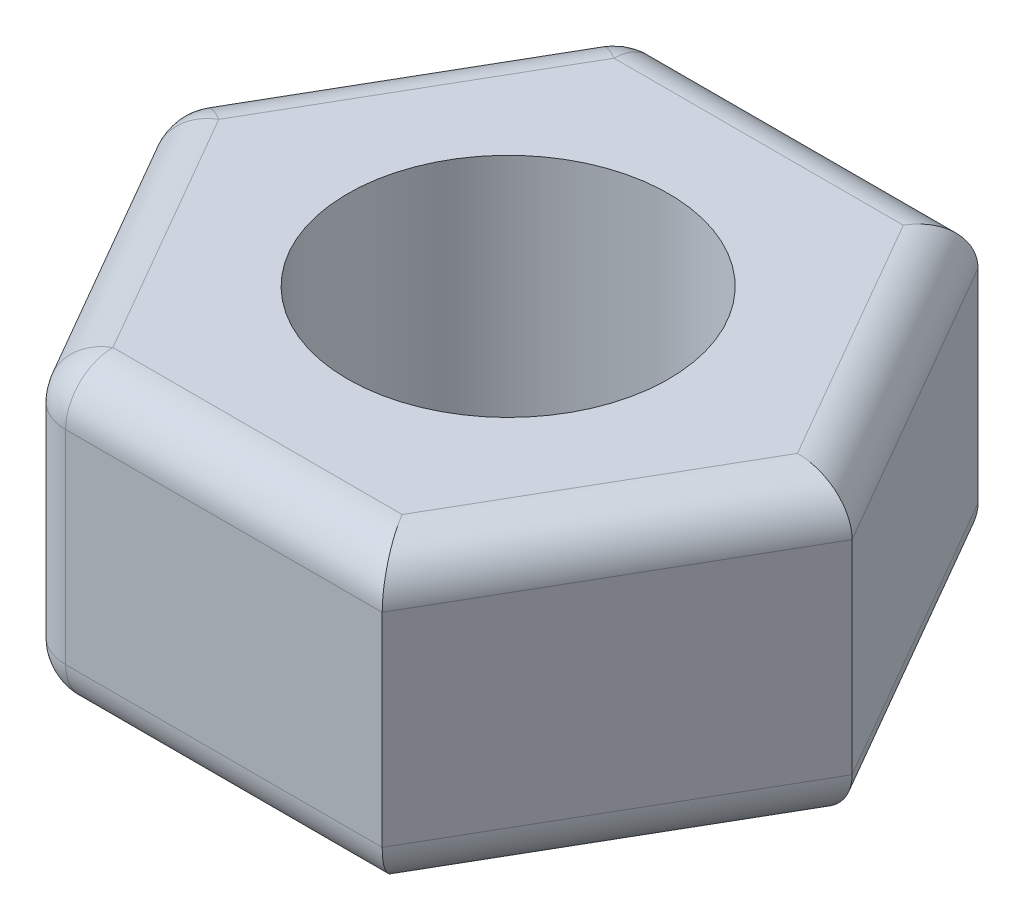
ISO-10303-21;
HEADER;
FILE_DESCRIPTION(('STEP AP214'),'2;1');
FILE_NAME('part.step','',(''),(''),'','','');
FILE_SCHEMA(('AUTOMOTIVE_DESIGN { 1 0 10303 214 1 1 1 1 }'));
ENDSEC;
DATA;
#1=APPLICATION_CONTEXT('core data for automotive mechanical design processes');
#2=APPLICATION_PROTOCOL_DEFINITION('international standard','automotive_design',2000,#1);
#3=PRODUCT_CONTEXT('',#1,'mechanical');
#4=PRODUCT('Part','Part','',(#3));
#5=PRODUCT_RELATED_PRODUCT_CATEGORY('part','',(#4));
#6=PRODUCT_DEFINITION_FORMATION('','',#4);
#7=PRODUCT_DEFINITION_CONTEXT('part definition',#1,'design');
#8=PRODUCT_DEFINITION('design','',#6,#7);
#9=PRODUCT_DEFINITION_SHAPE('','',#8);
#10=(LENGTH_UNIT() NAMED_UNIT(*) SI_UNIT(.MILLI.,.METRE.));
#11=(NAMED_UNIT(*) PLANE_ANGLE_UNIT() SI_UNIT($,.RADIAN.));
#12=(NAMED_UNIT(*) SI_UNIT($,.STERADIAN.) SOLID_ANGLE_UNIT());
#13=UNCERTAINTY_MEASURE_WITH_UNIT(LENGTH_MEASURE(1.E-05),#10,'distance_accuracy_value','');
#14=(GEOMETRIC_REPRESENTATION_CONTEXT(3) GLOBAL_UNCERTAINTY_ASSIGNED_CONTEXT((#13)) GLOBAL_UNIT_ASSIGNED_CONTEXT((#10,
#11,#12)) REPRESENTATION_CONTEXT('',''));
#15=CARTESIAN_POINT('',(0.,0.,0.));
#16=DIRECTION('',(0.,0.,1.));
#17=DIRECTION('',(1.,0.,0.));
#18=AXIS2_PLACEMENT_3D('',#15,#16,#17);
#19=CARTESIAN_POINT('',(3.63220000000007,6.2992,6.29115494325163));
#20=DIRECTION('',(-0.866025403784441,0.,-0.499999999999995));
#21=DIRECTION('',(-0.499999999999995,0.,0.866025403784442));
#22=AXIS2_PLACEMENT_3D('',#19,#20,#21);
#23=PLANE('',#22);
#24=DIRECTION('',(0.,-1.,0.));
#25=VECTOR('',#24,1.);
#26=CARTESIAN_POINT('',(3.63220000000007,6.2992,6.29115494325163));
#27=LINE('',#26,#25);
#28=CARTESIAN_POINT('',(3.63220000000007,5.2992,6.29115494325163));
#29=VERTEX_POINT('',#28);
#30=CARTESIAN_POINT('',(3.63220000000007,1.,6.29115494325163));
#31=VERTEX_POINT('',#30);
#32=EDGE_CURVE('E298',#29,#31,#27,.T.);
#33=ORIENTED_EDGE('',*,*,#32,.T.);
#34=DIRECTION('',(0.499999999999995,0.,-0.866025403784442));
#35=VECTOR('',#34,1.);
#36=CARTESIAN_POINT('',(3.63220000000007,1.,6.29115494325163));
#37=LINE('',#36,#35);
#38=CARTESIAN_POINT('',(7.2644,1.,0.));
#39=VERTEX_POINT('',#38);
#40=EDGE_CURVE('E232',#31,#39,#37,.T.);
#41=ORIENTED_EDGE('',*,*,#40,.T.);
#42=DIRECTION('',(0.,-1.,0.));
#43=VECTOR('',#42,1.);
#44=CARTESIAN_POINT('',(7.2644,6.2992,0.));
#45=LINE('',#44,#43);
#46=CARTESIAN_POINT('',(7.2644,5.2992,0.));
#47=VERTEX_POINT('',#46);
#48=EDGE_CURVE('E301',#47,#39,#45,.T.);
#49=ORIENTED_EDGE('',*,*,#48,.F.);
#50=DIRECTION('',(0.499999999999995,0.,-0.866025403784442));
#51=VECTOR('',#50,1.);
#52=CARTESIAN_POINT('',(3.63220000000007,5.2992,6.29115494325163));
#53=LINE('',#52,#51);
#54=EDGE_CURVE('E230',#47,#29,#53,.F.);
#55=ORIENTED_EDGE('',*,*,#54,.T.);
#56=EDGE_LOOP('',(#33,#41,#49,#55));
#57=FACE_BOUND('',#56,.T.);
#58=ADVANCED_FACE('F38',(#57),#23,.F.);
#59=CARTESIAN_POINT('',(7.2644,6.2992,0.));
#60=DIRECTION('',(-0.866025403784438,0.,0.500000000000001));
#61=DIRECTION('',(0.500000000000001,0.,0.866025403784438));
#62=AXIS2_PLACEMENT_3D('',#59,#60,#61);
#63=PLANE('',#62);
#64=ORIENTED_EDGE('',*,*,#48,.T.);
#65=DIRECTION('',(-0.500000000000001,0.,-0.866025403784438));
#66=VECTOR('',#65,1.);
#67=CARTESIAN_POINT('',(7.2644,1.,0.));
#68=LINE('',#67,#66);
#69=CARTESIAN_POINT('',(3.63219999999999,1.,-6.29115494325168));
#70=VERTEX_POINT('',#69);
#71=EDGE_CURVE('E228',#39,#70,#68,.T.);
#72=ORIENTED_EDGE('',*,*,#71,.T.);
#73=DIRECTION('',(0.,-1.,0.));
#74=VECTOR('',#73,1.);
#75=CARTESIAN_POINT('',(3.63219999999999,6.2992,-6.29115494325168));
#76=LINE('',#75,#74);
#77=CARTESIAN_POINT('',(3.63219999999999,5.2992,-6.29115494325168));
#78=VERTEX_POINT('',#77);
#79=EDGE_CURVE('E306',#78,#70,#76,.T.);
#80=ORIENTED_EDGE('',*,*,#79,.F.);
#81=DIRECTION('',(-0.500000000000001,0.,-0.866025403784438));
#82=VECTOR('',#81,1.);
#83=CARTESIAN_POINT('',(7.2644,5.2992,0.));
#84=LINE('',#83,#82);
#85=EDGE_CURVE('E226',#78,#47,#84,.F.);
#86=ORIENTED_EDGE('',*,*,#85,.T.);
#87=EDGE_LOOP('',(#64,#72,#80,#86));
#88=FACE_BOUND('',#87,.T.);
#89=ADVANCED_FACE('F337',(#88),#63,.F.);
#90=CARTESIAN_POINT('',(3.63219999999999,6.2992,-6.29115494325168));
#91=DIRECTION('',(0.,0.,1.));
#92=DIRECTION('',(1.,0.,0.));
#93=AXIS2_PLACEMENT_3D('',#90,#91,#92);
#94=PLANE('',#93);
#95=ORIENTED_EDGE('',*,*,#79,.T.);
#96=DIRECTION('',(-1.,0.,0.));
#97=VECTOR('',#96,1.);
#98=CARTESIAN_POINT('',(3.63219999999999,1.,-6.29115494325168));
#99=LINE('',#98,#97);
#100=CARTESIAN_POINT('',(-3.0548497308104,1.,-6.29115494325166));
#101=VERTEX_POINT('',#100);
#102=EDGE_CURVE('E198',#70,#101,#99,.T.);
#103=ORIENTED_EDGE('',*,*,#102,.T.);
#104=DIRECTION('',(0.,-1.,0.));
#105=VECTOR('',#104,1.);
#106=CARTESIAN_POINT('',(-3.0548497308104,6.2992,-6.29115494325166));
#107=LINE('',#106,#105);
#108=CARTESIAN_POINT('',(-3.0548497308104,5.2992,-6.29115494325166));
#109=VERTEX_POINT('',#108);
#110=EDGE_CURVE('E195',#101,#109,#107,.F.);
#111=ORIENTED_EDGE('',*,*,#110,.T.);
#112=DIRECTION('',(-1.,0.,0.));
#113=VECTOR('',#112,1.);
#114=CARTESIAN_POINT('',(3.63219999999999,5.2992,-6.29115494325168));
#115=LINE('',#114,#113);
#116=EDGE_CURVE('E193',#109,#78,#115,.F.);
#117=ORIENTED_EDGE('',*,*,#116,.T.);
#118=EDGE_LOOP('',(#95,#103,#111,#117));
#119=FACE_BOUND('',#118,.T.);
#120=ADVANCED_FACE('F341',(#119),#94,.F.);
#121=CARTESIAN_POINT('',(-3.63220000000003,6.2992,-6.29115494325166));
#122=DIRECTION('',(0.866025403784441,0.,0.499999999999995));
#123=DIRECTION('',(0.499999999999995,0.,-0.866025403784442));
#124=AXIS2_PLACEMENT_3D('',#121,#122,#123);
#125=PLANE('',#124);
#126=DIRECTION('',(-0.499999999999995,0.,0.866025403784442));
#127=VECTOR('',#126,1.);
#128=CARTESIAN_POINT('',(-3.63220000000003,5.2992,-6.29115494325166));
#129=LINE('',#128,#127);
#130=CARTESIAN_POINT('',(-6.97572486540519,5.2992,-0.499999999999951));
#131=VERTEX_POINT('',#130);
#132=CARTESIAN_POINT('',(-3.92087513459484,5.2992,-5.79115494325166));
#133=VERTEX_POINT('',#132);
#134=EDGE_CURVE('E178',#131,#133,#129,.F.);
#135=ORIENTED_EDGE('',*,*,#134,.T.);
#136=DIRECTION('',(0.,-1.,0.));
#137=VECTOR('',#136,1.);
#138=CARTESIAN_POINT('',(-3.92087513459484,6.2992,-5.79115494325166));
#139=LINE('',#138,#137);
#140=CARTESIAN_POINT('',(-3.92087513459484,1.,-5.79115494325166));
#141=VERTEX_POINT('',#140);
#142=EDGE_CURVE('E191',#133,#141,#139,.T.);
#143=ORIENTED_EDGE('',*,*,#142,.T.);
#144=DIRECTION('',(-0.499999999999995,0.,0.866025403784442));
#145=VECTOR('',#144,1.);
#146=CARTESIAN_POINT('',(-3.63220000000003,1.,-6.29115494325166));
#147=LINE('',#146,#145);
#148=CARTESIAN_POINT('',(-6.97572486540519,1.,-0.499999999999952));
#149=VERTEX_POINT('',#148);
#150=EDGE_CURVE('E189',#141,#149,#147,.T.);
#151=ORIENTED_EDGE('',*,*,#150,.T.);
#152=DIRECTION('',(0.,-1.,0.));
#153=VECTOR('',#152,1.);
#154=CARTESIAN_POINT('',(-6.97572486540519,6.2992,-0.499999999999952));
#155=LINE('',#154,#153);
#156=EDGE_CURVE('E165',#149,#131,#155,.F.);
#157=ORIENTED_EDGE('',*,*,#156,.T.);
#158=EDGE_LOOP('',(#135,#143,#151,#157));
#159=FACE_BOUND('',#158,.T.);
#160=ADVANCED_FACE('F372',(#159),#125,.F.);
#161=CARTESIAN_POINT('',(-7.2644,6.2992,0.));
#162=DIRECTION('',(0.866025403784435,0.,-0.500000000000007));
#163=DIRECTION('',(-0.500000000000007,0.,-0.866025403784435));
#164=AXIS2_PLACEMENT_3D('',#161,#162,#163);
#165=PLANE('',#164);
#166=DIRECTION('',(0.500000000000007,0.,0.866025403784435));
#167=VECTOR('',#166,1.);
#168=CARTESIAN_POINT('',(-7.2644,1.,0.));
#169=LINE('',#168,#167);
#170=CARTESIAN_POINT('',(-6.97572486540518,1.,0.500000000000049));
#171=VERTEX_POINT('',#170);
#172=CARTESIAN_POINT('',(-3.92087513459476,1.,5.79115494325171));
#173=VERTEX_POINT('',#172);
#174=EDGE_CURVE('E208',#171,#173,#169,.T.);
#175=ORIENTED_EDGE('',*,*,#174,.T.);
#176=DIRECTION('',(0.,-1.,0.));
#177=VECTOR('',#176,1.);
#178=CARTESIAN_POINT('',(-3.92087513459476,6.2992,5.79115494325171));
#179=LINE('',#178,#177);
#180=CARTESIAN_POINT('',(-3.92087513459476,5.2992,5.79115494325171));
#181=VERTEX_POINT('',#180);
#182=EDGE_CURVE('E150',#173,#181,#179,.F.);
#183=ORIENTED_EDGE('',*,*,#182,.T.);
#184=DIRECTION('',(0.500000000000007,0.,0.866025403784435));
#185=VECTOR('',#184,1.);
#186=CARTESIAN_POINT('',(-7.2644,5.2992,0.));
#187=LINE('',#186,#185);
#188=CARTESIAN_POINT('',(-6.97572486540518,5.2992,0.500000000000051));
#189=VERTEX_POINT('',#188);
#190=EDGE_CURVE('E144',#181,#189,#187,.F.);
#191=ORIENTED_EDGE('',*,*,#190,.T.);
#192=DIRECTION('',(0.,-1.,0.));
#193=VECTOR('',#192,1.);
#194=CARTESIAN_POINT('',(-6.97572486540518,6.2992,0.500000000000049));
#195=LINE('',#194,#193);
#196=EDGE_CURVE('E148',#189,#171,#195,.T.);
#197=ORIENTED_EDGE('',*,*,#196,.T.);
#198=EDGE_LOOP('',(#175,#183,#191,#197));
#199=FACE_BOUND('',#198,.T.);
#200=ADVANCED_FACE('F146',(#199),#165,.F.);
#201=CARTESIAN_POINT('',(-3.63219999999994,6.2992,6.29115494325171));
#202=DIRECTION('',(0.,0.,-1.));
#203=DIRECTION('',(-1.,0.,0.));
#204=AXIS2_PLACEMENT_3D('',#201,#202,#203);
#205=PLANE('',#204);
#206=DIRECTION('',(0.,-1.,0.));
#207=VECTOR('',#206,1.);
#208=CARTESIAN_POINT('',(-3.05484973081032,6.2992,6.2911549432517));
#209=LINE('',#208,#207);
#210=CARTESIAN_POINT('',(-3.05484973081032,5.2992,6.2911549432517));
#211=VERTEX_POINT('',#210);
#212=CARTESIAN_POINT('',(-3.05484973081032,1.,6.2911549432517));
#213=VERTEX_POINT('',#212);
#214=EDGE_CURVE('E204',#211,#213,#209,.T.);
#215=ORIENTED_EDGE('',*,*,#214,.T.);
#216=DIRECTION('',(1.,0.,0.));
#217=VECTOR('',#216,1.);
#218=CARTESIAN_POINT('',(-3.63219999999994,1.,6.29115494325171));
#219=LINE('',#218,#217);
#220=EDGE_CURVE('E206',#213,#31,#219,.T.);
#221=ORIENTED_EDGE('',*,*,#220,.T.);
#222=ORIENTED_EDGE('',*,*,#32,.F.);
#223=DIRECTION('',(1.,0.,0.));
#224=VECTOR('',#223,1.);
#225=CARTESIAN_POINT('',(-2.47749946162069,5.2992,6.2911549432517));
#226=LINE('',#225,#224);
#227=EDGE_CURVE('E202',#29,#211,#226,.F.);
#228=ORIENTED_EDGE('',*,*,#227,.T.);
#229=EDGE_LOOP('',(#215,#221,#222,#228));
#230=FACE_BOUND('',#229,.T.);
#231=ADVANCED_FACE('F303',(#230),#205,.F.);
#232=CARTESIAN_POINT('',(0.,6.2992,0.));
#233=DIRECTION('',(0.,1.,0.));
#234=DIRECTION('',(0.,0.,1.));
#235=AXIS2_PLACEMENT_3D('',#232,#233,#234);
#236=PLANE('',#235);
#237=CARTESIAN_POINT('',(0.,6.2992,0.));
#238=DIRECTION('',(0.,1.,0.));
#239=DIRECTION('',(0.,0.,1.));
#240=AXIS2_PLACEMENT_3D('',#237,#238,#239);
#241=CIRCLE('',#240,3.3909);
#242=CARTESIAN_POINT('',(0.,6.2992,3.3909));
#243=VERTEX_POINT('',#242);
#244=EDGE_CURVE('E187',#243,#243,#241,.T.);
#245=ORIENTED_EDGE('',*,*,#244,.F.);
#246=EDGE_LOOP('',(#245));
#247=FACE_BOUND('',#246,.T.);
#248=DIRECTION('',(-0.500000000000001,0.,-0.866025403784438));
#249=VECTOR('',#248,1.);
#250=CARTESIAN_POINT('',(2.76617459621555,6.2992,-5.79115494325168));
#251=LINE('',#250,#249);
#252=CARTESIAN_POINT('',(6.10969946162075,6.2992,0.));
#253=VERTEX_POINT('',#252);
#254=CARTESIAN_POINT('',(3.05484973081036,6.2992,-5.29115494325168));
#255=VERTEX_POINT('',#254);
#256=EDGE_CURVE('E47',#253,#255,#251,.T.);
#257=ORIENTED_EDGE('',*,*,#256,.T.);
#258=DIRECTION('',(-1.,0.,0.));
#259=VECTOR('',#258,1.);
#260=CARTESIAN_POINT('',(-2.47749946162077,6.2992,-5.29115494325166));
#261=LINE('',#260,#259);
#262=CARTESIAN_POINT('',(-3.0548497308104,6.2992,-5.29115494325166));
#263=VERTEX_POINT('',#262);
#264=EDGE_CURVE('E11',#255,#263,#261,.T.);
#265=ORIENTED_EDGE('',*,*,#264,.T.);
#266=DIRECTION('',(-0.499999999999995,0.,0.866025403784442));
#267=VECTOR('',#266,1.);
#268=CARTESIAN_POINT('',(-5.82102432702594,6.2992,-0.499999999999955));
#269=LINE('',#268,#267);
#270=CARTESIAN_POINT('',(-6.10969946162075,6.2992,0.));
#271=VERTEX_POINT('',#270);
#272=EDGE_CURVE('E164',#263,#271,#269,.T.);
#273=ORIENTED_EDGE('',*,*,#272,.T.);
#274=DIRECTION('',(0.500000000000007,0.,0.866025403784435));
#275=VECTOR('',#274,1.);
#276=CARTESIAN_POINT('',(-2.76617459621551,6.2992,5.7911549432517));
#277=LINE('',#276,#275);
#278=CARTESIAN_POINT('',(-3.05484973081033,6.2992,5.2911549432517));
#279=VERTEX_POINT('',#278);
#280=EDGE_CURVE('E153',#271,#279,#277,.T.);
#281=ORIENTED_EDGE('',*,*,#280,.T.);
#282=DIRECTION('',(1.,0.,0.));
#283=VECTOR('',#282,1.);
#284=CARTESIAN_POINT('',(3.63220000000006,6.2992,5.29115494325163));
#285=LINE('',#284,#283);
#286=CARTESIAN_POINT('',(3.05484973081044,6.2992,5.29115494325164));
#287=VERTEX_POINT('',#286);
#288=EDGE_CURVE('E234',#279,#287,#285,.T.);
#289=ORIENTED_EDGE('',*,*,#288,.T.);
#290=DIRECTION('',(0.499999999999995,0.,-0.866025403784442));
#291=VECTOR('',#290,1.);
#292=CARTESIAN_POINT('',(6.39837459621556,6.2992,-0.499999999999996));
#293=LINE('',#292,#291);
#294=EDGE_CURVE('E58',#287,#253,#293,.T.);
#295=ORIENTED_EDGE('',*,*,#294,.T.);
#296=EDGE_LOOP('',(#257,#265,#273,#281,#289,#295));
#297=FACE_BOUND('',#296,.T.);
#298=ADVANCED_FACE('F315',(#247,#297),#236,.T.);
#299=CARTESIAN_POINT('',(0.,0.,0.));
#300=DIRECTION('',(0.,1.,0.));
#301=DIRECTION('',(0.,0.,1.));
#302=AXIS2_PLACEMENT_3D('',#299,#300,#301);
#303=PLANE('',#302);
#304=DIRECTION('',(1.,0.,0.));
#305=VECTOR('',#304,1.);
#306=CARTESIAN_POINT('',(0.,0.,5.29115494325167));
#307=LINE('',#306,#305);
#308=CARTESIAN_POINT('',(3.05484973081044,0.,5.29115494325164));
#309=VERTEX_POINT('',#308);
#310=CARTESIAN_POINT('',(-3.05484973081033,0.,5.2911549432517));
#311=VERTEX_POINT('',#310);
#312=EDGE_CURVE('E213',#309,#311,#307,.F.);
#313=ORIENTED_EDGE('',*,*,#312,.T.);
#314=DIRECTION('',(0.500000000000007,0.,0.866025403784435));
#315=VECTOR('',#314,1.);
#316=CARTESIAN_POINT('',(-4.58227459621554,0.,2.64557747162587));
#317=LINE('',#316,#315);
#318=CARTESIAN_POINT('',(-6.10969946162075,0.,0.));
#319=VERTEX_POINT('',#318);
#320=EDGE_CURVE('E223',#311,#319,#317,.F.);
#321=ORIENTED_EDGE('',*,*,#320,.T.);
#322=DIRECTION('',(-0.499999999999995,0.,0.866025403784442));
#323=VECTOR('',#322,1.);
#324=CARTESIAN_POINT('',(-4.58227459621557,0.,-2.64557747162581));
#325=LINE('',#324,#323);
#326=CARTESIAN_POINT('',(-3.0548497308104,0.,-5.29115494325166));
#327=VERTEX_POINT('',#326);
#328=EDGE_CURVE('E221',#319,#327,#325,.F.);
#329=ORIENTED_EDGE('',*,*,#328,.T.);
#330=DIRECTION('',(-1.,0.,0.));
#331=VECTOR('',#330,1.);
#332=CARTESIAN_POINT('',(0.,0.,-5.29115494325167));
#333=LINE('',#332,#331);
#334=CARTESIAN_POINT('',(3.05484973081036,0.,-5.29115494325168));
#335=VERTEX_POINT('',#334);
#336=EDGE_CURVE('E219',#327,#335,#333,.F.);
#337=ORIENTED_EDGE('',*,*,#336,.T.);
#338=DIRECTION('',(-0.500000000000001,0.,-0.866025403784438));
#339=VECTOR('',#338,1.);
#340=CARTESIAN_POINT('',(4.58227459621555,0.,-2.64557747162584));
#341=LINE('',#340,#339);
#342=CARTESIAN_POINT('',(6.10969946162075,0.,0.));
#343=VERTEX_POINT('',#342);
#344=EDGE_CURVE('E217',#335,#343,#341,.F.);
#345=ORIENTED_EDGE('',*,*,#344,.T.);
#346=DIRECTION('',(0.499999999999995,0.,-0.866025403784442));
#347=VECTOR('',#346,1.);
#348=CARTESIAN_POINT('',(4.5822745962156,0.,2.64557747162582));
#349=LINE('',#348,#347);
#350=EDGE_CURVE('E215',#343,#309,#349,.F.);
#351=ORIENTED_EDGE('',*,*,#350,.T.);
#352=EDGE_LOOP('',(#313,#321,#329,#337,#345,#351));
#353=FACE_BOUND('',#352,.T.);
#354=CARTESIAN_POINT('',(0.,0.,0.));
#355=DIRECTION('',(0.,1.,0.));
#356=DIRECTION('',(0.,0.,1.));
#357=AXIS2_PLACEMENT_3D('',#354,#355,#356);
#358=CIRCLE('',#357,3.3909);
#359=CARTESIAN_POINT('',(0.,0.,3.3909));
#360=VERTEX_POINT('',#359);
#361=EDGE_CURVE('E307',#360,#360,#358,.T.);
#362=ORIENTED_EDGE('',*,*,#361,.T.);
#363=EDGE_LOOP('',(#362));
#364=FACE_BOUND('',#363,.T.);
#365=ADVANCED_FACE('F383',(#353,#364),#303,.F.);
#366=CARTESIAN_POINT('',(0.,0.,0.));
#367=DIRECTION('',(0.,1.,0.));
#368=DIRECTION('',(0.,0.,1.));
#369=AXIS2_PLACEMENT_3D('',#366,#367,#368);
#370=CYLINDRICAL_SURFACE('',#369,3.3909);
#371=ORIENTED_EDGE('',*,*,#361,.F.);
#372=EDGE_LOOP('',(#371));
#373=FACE_BOUND('',#372,.T.);
#374=ORIENTED_EDGE('',*,*,#244,.T.);
#375=EDGE_LOOP('',(#374));
#376=FACE_BOUND('',#375,.T.);
#377=ADVANCED_FACE('F407',(#373,#376),#370,.F.);
#378=CARTESIAN_POINT('',(-4.58227459621554,5.2992,2.64557747162587));
#379=DIRECTION('',(-0.500000000000007,0.,-0.866025403784435));
#380=DIRECTION('',(-0.866025403784435,0.,0.500000000000007));
#381=AXIS2_PLACEMENT_3D('',#378,#379,#380);
#382=CYLINDRICAL_SURFACE('',#381,1.);
#383=ORIENTED_EDGE('',*,*,#190,.F.);
#384=CARTESIAN_POINT('',(-3.05484973081033,5.2992,5.2911549432517));
#385=DIRECTION('',(-0.500000000000007,0.,-0.866025403784435));
#386=DIRECTION('',(-0.866025403784435,0.,0.500000000000007));
#387=AXIS2_PLACEMENT_3D('',#384,#385,#386);
#388=CIRCLE('',#387,1.);
#389=EDGE_CURVE('E211',#181,#279,#388,.T.);
#390=ORIENTED_EDGE('',*,*,#389,.T.);
#391=ORIENTED_EDGE('',*,*,#280,.F.);
#392=CARTESIAN_POINT('',(-6.10969946162075,5.2992,0.));
#393=DIRECTION('',(-0.500000000000007,0.,-0.866025403784435));
#394=DIRECTION('',(-0.866025403784435,0.,0.500000000000007));
#395=AXIS2_PLACEMENT_3D('',#392,#393,#394);
#396=CIRCLE('',#395,1.);
#397=EDGE_CURVE('E157',#271,#189,#396,.F.);
#398=ORIENTED_EDGE('',*,*,#397,.T.);
#399=EDGE_LOOP('',(#383,#390,#391,#398));
#400=FACE_BOUND('',#399,.T.);
#401=ADVANCED_FACE('F159',(#400),#382,.T.);
#402=CARTESIAN_POINT('',(-4.58227459621557,5.2992,-2.64557747162581));
#403=DIRECTION('',(0.499999999999995,0.,-0.866025403784442));
#404=DIRECTION('',(-0.866025403784441,0.,-0.499999999999995));
#405=AXIS2_PLACEMENT_3D('',#402,#403,#404);
#406=CYLINDRICAL_SURFACE('',#405,1.);
#407=ORIENTED_EDGE('',*,*,#272,.F.);
#408=CARTESIAN_POINT('',(-3.0548497308104,5.2992,-5.29115494325166));
#409=DIRECTION('',(0.499999999999995,0.,-0.866025403784442));
#410=DIRECTION('',(-0.866025403784441,0.,-0.499999999999995));
#411=AXIS2_PLACEMENT_3D('',#408,#409,#410);
#412=CIRCLE('',#411,1.);
#413=EDGE_CURVE('E200',#263,#133,#412,.F.);
#414=ORIENTED_EDGE('',*,*,#413,.T.);
#415=ORIENTED_EDGE('',*,*,#134,.F.);
#416=CARTESIAN_POINT('',(-6.10969946162075,5.2992,0.));
#417=DIRECTION('',(-0.499999999999995,0.,0.866025403784441));
#418=DIRECTION('',(0.866025403784442,0.,0.499999999999995));
#419=AXIS2_PLACEMENT_3D('',#416,#417,#418);
#420=CIRCLE('',#419,1.);
#421=EDGE_CURVE('E170',#271,#131,#420,.T.);
#422=ORIENTED_EDGE('',*,*,#421,.F.);
#423=EDGE_LOOP('',(#407,#414,#415,#422));
#424=FACE_BOUND('',#423,.T.);
#425=ADVANCED_FACE('F369',(#424),#406,.T.);
#426=CARTESIAN_POINT('',(-6.10969946162075,5.2992,0.));
#427=DIRECTION('',(0.866025403784441,0.,0.499999999999995));
#428=DIRECTION('',(0.499999999999995,0.,-0.866025403784442));
#429=AXIS2_PLACEMENT_3D('',#426,#427,#428);
#430=SPHERICAL_SURFACE('',#429,1.);
#431=ORIENTED_EDGE('',*,*,#397,.F.);
#432=ORIENTED_EDGE('',*,*,#421,.T.);
#433=CARTESIAN_POINT('',(-6.10969946162075,5.2992,0.));
#434=DIRECTION('',(0.,-1.,0.));
#435=DIRECTION('',(0.,0.,-1.));
#436=AXIS2_PLACEMENT_3D('',#433,#434,#435);
#437=CIRCLE('',#436,1.);
#438=EDGE_CURVE('E168',#189,#131,#437,.T.);
#439=ORIENTED_EDGE('',*,*,#438,.F.);
#440=EDGE_LOOP('',(#431,#432,#439));
#441=FACE_BOUND('',#440,.T.);
#442=ADVANCED_FACE('F169',(#441),#430,.T.);
#443=CARTESIAN_POINT('',(-6.10969946162075,6.2992,0.));
#444=DIRECTION('',(0.,-1.,0.));
#445=DIRECTION('',(0.,0.,-1.));
#446=AXIS2_PLACEMENT_3D('',#443,#444,#445);
#447=CYLINDRICAL_SURFACE('',#446,1.);
#448=ORIENTED_EDGE('',*,*,#156,.F.);
#449=CARTESIAN_POINT('',(-6.10969946162075,1.,0.));
#450=DIRECTION('',(0.,-1.,0.));
#451=DIRECTION('',(0.,0.,-1.));
#452=AXIS2_PLACEMENT_3D('',#449,#450,#451);
#453=CIRCLE('',#452,1.);
#454=EDGE_CURVE('E177',#149,#171,#453,.F.);
#455=ORIENTED_EDGE('',*,*,#454,.T.);
#456=ORIENTED_EDGE('',*,*,#196,.F.);
#457=ORIENTED_EDGE('',*,*,#438,.T.);
#458=EDGE_LOOP('',(#448,#455,#456,#457));
#459=FACE_BOUND('',#458,.T.);
#460=ADVANCED_FACE('F175',(#459),#447,.T.);
#461=CARTESIAN_POINT('',(4.5822745962156,5.2992,2.64557747162582));
#462=DIRECTION('',(-0.499999999999995,0.,0.866025403784442));
#463=DIRECTION('',(0.866025403784441,0.,0.499999999999995));
#464=AXIS2_PLACEMENT_3D('',#461,#462,#463);
#465=CYLINDRICAL_SURFACE('',#464,1.);
#466=CARTESIAN_POINT('',(3.05484973081044,5.2992,5.29115494325164));
#467=DIRECTION('',(-0.866025403784435,0.,0.500000000000007));
#468=DIRECTION('',(-0.500000000000007,0.,-0.866025403784435));
#469=AXIS2_PLACEMENT_3D('',#466,#467,#468);
#470=ELLIPSE('',#469,1.15470053837925,1.);
#471=EDGE_CURVE('E282',#29,#287,#470,.T.);
#472=ORIENTED_EDGE('',*,*,#471,.F.);
#473=ORIENTED_EDGE('',*,*,#54,.F.);
#474=CARTESIAN_POINT('',(6.10969946162075,5.2992,0.));
#475=DIRECTION('',(0.,0.,1.));
#476=DIRECTION('',(-1.,0.,0.));
#477=AXIS2_PLACEMENT_3D('',#474,#475,#476);
#478=ELLIPSE('',#477,1.15470053837925,1.);
#479=EDGE_CURVE('E42',#253,#47,#478,.F.);
#480=ORIENTED_EDGE('',*,*,#479,.F.);
#481=ORIENTED_EDGE('',*,*,#294,.F.);
#482=EDGE_LOOP('',(#472,#473,#480,#481));
#483=FACE_BOUND('',#482,.T.);
#484=ADVANCED_FACE('F40',(#483),#465,.T.);
#485=CARTESIAN_POINT('',(4.58227459621555,5.2992,-2.64557747162584));
#486=DIRECTION('',(0.500000000000001,0.,0.866025403784438));
#487=DIRECTION('',(0.866025403784438,0.,-0.500000000000001));
#488=AXIS2_PLACEMENT_3D('',#485,#486,#487);
#489=CYLINDRICAL_SURFACE('',#488,1.);
#490=ORIENTED_EDGE('',*,*,#479,.T.);
#491=ORIENTED_EDGE('',*,*,#85,.F.);
#492=CARTESIAN_POINT('',(3.05484973081036,5.2992,-5.29115494325168));
#493=DIRECTION('',(0.86602540378444,0.,0.499999999999998));
#494=DIRECTION('',(-0.499999999999998,0.,0.86602540378444));
#495=AXIS2_PLACEMENT_3D('',#492,#493,#494);
#496=ELLIPSE('',#495,1.15470053837925,1.);
#497=EDGE_CURVE('E280',#255,#78,#496,.F.);
#498=ORIENTED_EDGE('',*,*,#497,.F.);
#499=ORIENTED_EDGE('',*,*,#256,.F.);
#500=EDGE_LOOP('',(#490,#491,#498,#499));
#501=FACE_BOUND('',#500,.T.);
#502=ADVANCED_FACE('F291',(#501),#489,.T.);
#503=CARTESIAN_POINT('',(0.,5.2992,5.29115494325167));
#504=DIRECTION('',(-1.,0.,0.));
#505=DIRECTION('',(0.,0.,1.));
#506=AXIS2_PLACEMENT_3D('',#503,#504,#505);
#507=CYLINDRICAL_SURFACE('',#506,1.);
#508=ORIENTED_EDGE('',*,*,#471,.T.);
#509=ORIENTED_EDGE('',*,*,#288,.F.);
#510=CARTESIAN_POINT('',(-3.05484973081033,5.2992,5.2911549432517));
#511=DIRECTION('',(-1.,0.,0.));
#512=DIRECTION('',(0.,0.,1.));
#513=AXIS2_PLACEMENT_3D('',#510,#511,#512);
#514=CIRCLE('',#513,1.);
#515=EDGE_CURVE('E277',#211,#279,#514,.T.);
#516=ORIENTED_EDGE('',*,*,#515,.F.);
#517=ORIENTED_EDGE('',*,*,#227,.F.);
#518=EDGE_LOOP('',(#508,#509,#516,#517));
#519=FACE_BOUND('',#518,.T.);
#520=ADVANCED_FACE('F317',(#519),#507,.T.);
#521=CARTESIAN_POINT('',(0.,5.2992,-5.29115494325167));
#522=DIRECTION('',(1.,0.,0.));
#523=DIRECTION('',(0.,0.,-1.));
#524=AXIS2_PLACEMENT_3D('',#521,#522,#523);
#525=CYLINDRICAL_SURFACE('',#524,1.);
#526=ORIENTED_EDGE('',*,*,#497,.T.);
#527=ORIENTED_EDGE('',*,*,#116,.F.);
#528=CARTESIAN_POINT('',(-3.0548497308104,5.2992,-5.29115494325166));
#529=DIRECTION('',(-1.,0.,0.));
#530=DIRECTION('',(0.,0.,1.));
#531=AXIS2_PLACEMENT_3D('',#528,#529,#530);
#532=CIRCLE('',#531,1.);
#533=EDGE_CURVE('E271',#263,#109,#532,.T.);
#534=ORIENTED_EDGE('',*,*,#533,.F.);
#535=ORIENTED_EDGE('',*,*,#264,.F.);
#536=EDGE_LOOP('',(#526,#527,#534,#535));
#537=FACE_BOUND('',#536,.T.);
#538=ADVANCED_FACE('F367',(#537),#525,.T.);
#539=CARTESIAN_POINT('',(-3.05484973081033,5.2992,5.2911549432517));
#540=DIRECTION('',(0.,0.,-1.));
#541=DIRECTION('',(-1.,0.,0.));
#542=AXIS2_PLACEMENT_3D('',#539,#540,#541);
#543=SPHERICAL_SURFACE('',#542,1.);
#544=ORIENTED_EDGE('',*,*,#515,.T.);
#545=ORIENTED_EDGE('',*,*,#389,.F.);
#546=CARTESIAN_POINT('',(-3.05484973081033,5.2992,5.2911549432517));
#547=DIRECTION('',(0.,-1.,0.));
#548=DIRECTION('',(0.,0.,-1.));
#549=AXIS2_PLACEMENT_3D('',#546,#547,#548);
#550=CIRCLE('',#549,1.);
#551=EDGE_CURVE('E268',#211,#181,#550,.T.);
#552=ORIENTED_EDGE('',*,*,#551,.F.);
#553=EDGE_LOOP('',(#544,#545,#552));
#554=FACE_BOUND('',#553,.T.);
#555=ADVANCED_FACE('F320',(#554),#543,.T.);
#556=CARTESIAN_POINT('',(2.76617459621563,1.,5.79115494325164));
#557=DIRECTION('',(0.499999999999995,0.,-0.866025403784442));
#558=DIRECTION('',(-0.866025403784441,0.,-0.499999999999995));
#559=AXIS2_PLACEMENT_3D('',#556,#557,#558);
#560=CYLINDRICAL_SURFACE('',#559,1.);
#561=CARTESIAN_POINT('',(3.05484973081044,1.,5.29115494325164));
#562=DIRECTION('',(0.866025403784435,0.,-0.500000000000007));
#563=DIRECTION('',(0.500000000000007,0.,0.866025403784435));
#564=AXIS2_PLACEMENT_3D('',#561,#562,#563);
#565=ELLIPSE('',#564,1.15470053837925,1.);
#566=EDGE_CURVE('E265',#309,#31,#565,.F.);
#567=ORIENTED_EDGE('',*,*,#566,.F.);
#568=ORIENTED_EDGE('',*,*,#350,.F.);
#569=CARTESIAN_POINT('',(6.10969946162075,1.,0.));
#570=DIRECTION('',(0.,0.,-1.));
#571=DIRECTION('',(1.,0.,0.));
#572=AXIS2_PLACEMENT_3D('',#569,#570,#571);
#573=ELLIPSE('',#572,1.15470053837925,1.);
#574=EDGE_CURVE('E274',#39,#343,#573,.T.);
#575=ORIENTED_EDGE('',*,*,#574,.F.);
#576=ORIENTED_EDGE('',*,*,#40,.F.);
#577=EDGE_LOOP('',(#567,#568,#575,#576));
#578=FACE_BOUND('',#577,.T.);
#579=ADVANCED_FACE('F333',(#578),#560,.T.);
#580=CARTESIAN_POINT('',(6.39837459621556,1.,0.500000000000001));
#581=DIRECTION('',(-0.500000000000001,0.,-0.866025403784438));
#582=DIRECTION('',(-0.866025403784438,0.,0.500000000000001));
#583=AXIS2_PLACEMENT_3D('',#580,#581,#582);
#584=CYLINDRICAL_SURFACE('',#583,1.);
#585=ORIENTED_EDGE('',*,*,#574,.T.);
#586=ORIENTED_EDGE('',*,*,#344,.F.);
#587=CARTESIAN_POINT('',(3.05484973081036,1.,-5.29115494325168));
#588=DIRECTION('',(-0.86602540378444,0.,-0.499999999999998));
#589=DIRECTION('',(0.499999999999998,0.,-0.86602540378444));
#590=AXIS2_PLACEMENT_3D('',#587,#588,#589);
#591=ELLIPSE('',#590,1.15470053837925,1.);
#592=EDGE_CURVE('E262',#70,#335,#591,.T.);
#593=ORIENTED_EDGE('',*,*,#592,.F.);
#594=ORIENTED_EDGE('',*,*,#71,.F.);
#595=EDGE_LOOP('',(#585,#586,#593,#594));
#596=FACE_BOUND('',#595,.T.);
#597=ADVANCED_FACE('F347',(#596),#584,.T.);
#598=CARTESIAN_POINT('',(-3.0548497308104,5.2992,-5.29115494325166));
#599=DIRECTION('',(0.,0.,1.));
#600=DIRECTION('',(1.,0.,0.));
#601=AXIS2_PLACEMENT_3D('',#598,#599,#600);
#602=SPHERICAL_SURFACE('',#601,1.);
#603=ORIENTED_EDGE('',*,*,#413,.F.);
#604=ORIENTED_EDGE('',*,*,#533,.T.);
#605=CARTESIAN_POINT('',(-3.0548497308104,5.2992,-5.29115494325166));
#606=DIRECTION('',(0.,-1.,0.));
#607=DIRECTION('',(0.,0.,-1.));
#608=AXIS2_PLACEMENT_3D('',#605,#606,#607);
#609=CIRCLE('',#608,1.);
#610=EDGE_CURVE('E260',#133,#109,#609,.T.);
#611=ORIENTED_EDGE('',*,*,#610,.F.);
#612=EDGE_LOOP('',(#603,#604,#611));
#613=FACE_BOUND('',#612,.T.);
#614=ADVANCED_FACE('F364',(#613),#602,.T.);
#615=CARTESIAN_POINT('',(-3.05484973081033,6.2992,5.2911549432517));
#616=DIRECTION('',(0.,-1.,0.));
#617=DIRECTION('',(0.,0.,-1.));
#618=AXIS2_PLACEMENT_3D('',#615,#616,#617);
#619=CYLINDRICAL_SURFACE('',#618,1.);
#620=ORIENTED_EDGE('',*,*,#551,.T.);
#621=ORIENTED_EDGE('',*,*,#182,.F.);
#622=CARTESIAN_POINT('',(-3.05484973081033,1.,5.2911549432517));
#623=DIRECTION('',(0.,-1.,0.));
#624=DIRECTION('',(0.,0.,-1.));
#625=AXIS2_PLACEMENT_3D('',#622,#623,#624);
#626=CIRCLE('',#625,1.);
#627=EDGE_CURVE('E257',#213,#173,#626,.T.);
#628=ORIENTED_EDGE('',*,*,#627,.F.);
#629=ORIENTED_EDGE('',*,*,#214,.F.);
#630=EDGE_LOOP('',(#620,#621,#628,#629));
#631=FACE_BOUND('',#630,.T.);
#632=ADVANCED_FACE('F324',(#631),#619,.T.);
#633=CARTESIAN_POINT('',(-3.63219999999995,1.,5.29115494325171));
#634=DIRECTION('',(1.,0.,0.));
#635=DIRECTION('',(0.,0.,-1.));
#636=AXIS2_PLACEMENT_3D('',#633,#634,#635);
#637=CYLINDRICAL_SURFACE('',#636,1.);
#638=ORIENTED_EDGE('',*,*,#566,.T.);
#639=ORIENTED_EDGE('',*,*,#220,.F.);
#640=CARTESIAN_POINT('',(-3.05484973081033,1.,5.2911549432517));
#641=DIRECTION('',(-1.,0.,0.));
#642=DIRECTION('',(0.,0.,1.));
#643=AXIS2_PLACEMENT_3D('',#640,#641,#642);
#644=CIRCLE('',#643,1.);
#645=EDGE_CURVE('E254',#311,#213,#644,.T.);
#646=ORIENTED_EDGE('',*,*,#645,.F.);
#647=ORIENTED_EDGE('',*,*,#312,.F.);
#648=EDGE_LOOP('',(#638,#639,#646,#647));
#649=FACE_BOUND('',#648,.T.);
#650=ADVANCED_FACE('F327',(#649),#637,.T.);
#651=CARTESIAN_POINT('',(3.63219999999999,1.,-5.29115494325168));
#652=DIRECTION('',(-1.,0.,0.));
#653=DIRECTION('',(0.,0.,1.));
#654=AXIS2_PLACEMENT_3D('',#651,#652,#653);
#655=CYLINDRICAL_SURFACE('',#654,1.);
#656=ORIENTED_EDGE('',*,*,#592,.T.);
#657=ORIENTED_EDGE('',*,*,#336,.F.);
#658=CARTESIAN_POINT('',(-3.0548497308104,1.,-5.29115494325166));
#659=DIRECTION('',(-1.,0.,0.));
#660=DIRECTION('',(0.,0.,1.));
#661=AXIS2_PLACEMENT_3D('',#658,#659,#660);
#662=CIRCLE('',#661,1.);
#663=EDGE_CURVE('E251',#101,#327,#662,.T.);
#664=ORIENTED_EDGE('',*,*,#663,.F.);
#665=ORIENTED_EDGE('',*,*,#102,.F.);
#666=EDGE_LOOP('',(#656,#657,#664,#665));
#667=FACE_BOUND('',#666,.T.);
#668=ADVANCED_FACE('F351',(#667),#655,.T.);
#669=CARTESIAN_POINT('',(-3.0548497308104,6.2992,-5.29115494325166));
#670=DIRECTION('',(0.,-1.,0.));
#671=DIRECTION('',(0.,0.,-1.));
#672=AXIS2_PLACEMENT_3D('',#669,#670,#671);
#673=CYLINDRICAL_SURFACE('',#672,1.);
#674=ORIENTED_EDGE('',*,*,#610,.T.);
#675=ORIENTED_EDGE('',*,*,#110,.F.);
#676=CARTESIAN_POINT('',(-3.0548497308104,1.,-5.29115494325166));
#677=DIRECTION('',(0.,-1.,0.));
#678=DIRECTION('',(0.,0.,-1.));
#679=AXIS2_PLACEMENT_3D('',#676,#677,#678);
#680=CIRCLE('',#679,1.);
#681=EDGE_CURVE('E248',#141,#101,#680,.T.);
#682=ORIENTED_EDGE('',*,*,#681,.F.);
#683=ORIENTED_EDGE('',*,*,#142,.F.);
#684=EDGE_LOOP('',(#674,#675,#682,#683));
#685=FACE_BOUND('',#684,.T.);
#686=ADVANCED_FACE('F359',(#685),#673,.T.);
#687=CARTESIAN_POINT('',(-3.05484973081033,1.,5.2911549432517));
#688=DIRECTION('',(0.,0.,1.));
#689=DIRECTION('',(1.,0.,0.));
#690=AXIS2_PLACEMENT_3D('',#687,#688,#689);
#691=SPHERICAL_SURFACE('',#690,1.);
#692=ORIENTED_EDGE('',*,*,#645,.T.);
#693=ORIENTED_EDGE('',*,*,#627,.T.);
#694=CARTESIAN_POINT('',(-3.05484973081033,1.,5.2911549432517));
#695=DIRECTION('',(0.500000000000007,0.,0.866025403784434));
#696=DIRECTION('',(0.866025403784434,0.,-0.500000000000007));
#697=AXIS2_PLACEMENT_3D('',#694,#695,#696);
#698=CIRCLE('',#697,1.);
#699=EDGE_CURVE('E245',#311,#173,#698,.F.);
#700=ORIENTED_EDGE('',*,*,#699,.F.);
#701=EDGE_LOOP('',(#692,#693,#700));
#702=FACE_BOUND('',#701,.T.);
#703=ADVANCED_FACE('F388',(#702),#691,.T.);
#704=CARTESIAN_POINT('',(-3.0548497308104,1.,-5.29115494325166));
#705=DIRECTION('',(0.,0.,1.));
#706=DIRECTION('',(1.,0.,0.));
#707=AXIS2_PLACEMENT_3D('',#704,#705,#706);
#708=SPHERICAL_SURFACE('',#707,1.);
#709=ORIENTED_EDGE('',*,*,#681,.T.);
#710=ORIENTED_EDGE('',*,*,#663,.T.);
#711=CARTESIAN_POINT('',(-3.0548497308104,1.,-5.29115494325166));
#712=DIRECTION('',(0.499999999999996,0.,-0.866025403784441));
#713=DIRECTION('',(-0.866025403784441,0.,-0.499999999999996));
#714=AXIS2_PLACEMENT_3D('',#711,#712,#713);
#715=CIRCLE('',#714,1.);
#716=EDGE_CURVE('E242',#141,#327,#715,.F.);
#717=ORIENTED_EDGE('',*,*,#716,.F.);
#718=EDGE_LOOP('',(#709,#710,#717));
#719=FACE_BOUND('',#718,.T.);
#720=ADVANCED_FACE('F355',(#719),#708,.T.);
#721=CARTESIAN_POINT('',(-6.39837459621556,1.,-0.499999999999956));
#722=DIRECTION('',(0.500000000000007,0.,0.866025403784435));
#723=DIRECTION('',(0.866025403784435,0.,-0.500000000000007));
#724=AXIS2_PLACEMENT_3D('',#721,#722,#723);
#725=CYLINDRICAL_SURFACE('',#724,1.);
#726=ORIENTED_EDGE('',*,*,#699,.T.);
#727=ORIENTED_EDGE('',*,*,#174,.F.);
#728=CARTESIAN_POINT('',(-6.10969946162075,1.,0.));
#729=DIRECTION('',(-0.500000000000007,0.,-0.866025403784435));
#730=DIRECTION('',(-0.866025403784435,0.,0.500000000000007));
#731=AXIS2_PLACEMENT_3D('',#728,#729,#730);
#732=CIRCLE('',#731,1.);
#733=EDGE_CURVE('E240',#319,#171,#732,.T.);
#734=ORIENTED_EDGE('',*,*,#733,.F.);
#735=ORIENTED_EDGE('',*,*,#320,.F.);
#736=EDGE_LOOP('',(#726,#727,#734,#735));
#737=FACE_BOUND('',#736,.T.);
#738=ADVANCED_FACE('F386',(#737),#725,.T.);
#739=CARTESIAN_POINT('',(-2.76617459621559,1.,-5.79115494325166));
#740=DIRECTION('',(-0.499999999999995,0.,0.866025403784442));
#741=DIRECTION('',(0.866025403784441,0.,0.499999999999995));
#742=AXIS2_PLACEMENT_3D('',#739,#740,#741);
#743=CYLINDRICAL_SURFACE('',#742,1.);
#744=ORIENTED_EDGE('',*,*,#716,.T.);
#745=ORIENTED_EDGE('',*,*,#328,.F.);
#746=CARTESIAN_POINT('',(-6.10969946162075,1.,0.));
#747=DIRECTION('',(-0.499999999999995,0.,0.866025403784442));
#748=DIRECTION('',(0.866025403784442,0.,0.499999999999995));
#749=AXIS2_PLACEMENT_3D('',#746,#747,#748);
#750=CIRCLE('',#749,1.);
#751=EDGE_CURVE('E238',#149,#319,#750,.T.);
#752=ORIENTED_EDGE('',*,*,#751,.F.);
#753=ORIENTED_EDGE('',*,*,#150,.F.);
#754=EDGE_LOOP('',(#744,#745,#752,#753));
#755=FACE_BOUND('',#754,.T.);
#756=ADVANCED_FACE('F380',(#755),#743,.T.);
#757=CARTESIAN_POINT('',(-6.10969946162075,1.,0.));
#758=DIRECTION('',(0.,1.,0.));
#759=DIRECTION('',(0.,0.,1.));
#760=AXIS2_PLACEMENT_3D('',#757,#758,#759);
#761=SPHERICAL_SURFACE('',#760,1.);
#762=ORIENTED_EDGE('',*,*,#733,.T.);
#763=ORIENTED_EDGE('',*,*,#454,.F.);
#764=ORIENTED_EDGE('',*,*,#751,.T.);
#765=EDGE_LOOP('',(#762,#763,#764));
#766=FACE_BOUND('',#765,.T.);
#767=ADVANCED_FACE('F375',(#766),#761,.T.);
#768=CLOSED_SHELL('',(#58,#89,#120,#160,#200,#231,#298,#365,#377,#401,#425,#442,#460,#484,#502,
#520,#538,#555,#579,#597,#614,#632,#650,#668,#686,#703,#720,#738,#756,#767));
#769=MANIFOLD_SOLID_BREP('B2',#768);
#770=ADVANCED_BREP_SHAPE_REPRESENTATION('',(#18,#769),#14);
#771=SHAPE_DEFINITION_REPRESENTATION(#9,#770);
ENDSEC;
END-ISO-10303-21;
